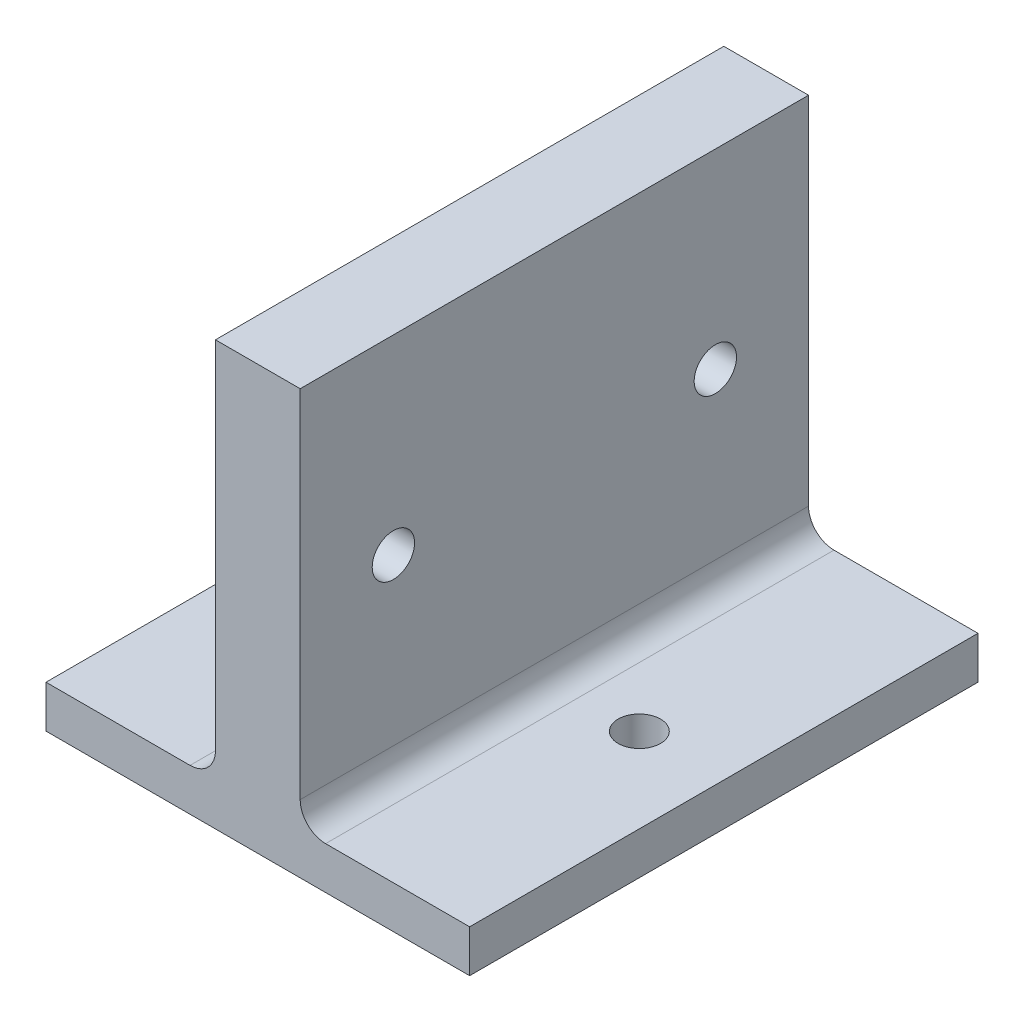
ISO-10303-21;
HEADER;
FILE_DESCRIPTION(('STEP AP214'),'2;1');
FILE_NAME('part.step','',(''),(''),'','','');
FILE_SCHEMA(('AUTOMOTIVE_DESIGN { 1 0 10303 214 1 1 1 1 }'));
ENDSEC;
DATA;
#1=APPLICATION_CONTEXT('core data for automotive mechanical design processes');
#2=APPLICATION_PROTOCOL_DEFINITION('international standard','automotive_design',2000,#1);
#3=PRODUCT_CONTEXT('',#1,'mechanical');
#4=PRODUCT('Part','Part','',(#3));
#5=PRODUCT_RELATED_PRODUCT_CATEGORY('part','',(#4));
#6=PRODUCT_DEFINITION_FORMATION('','',#4);
#7=PRODUCT_DEFINITION_CONTEXT('part definition',#1,'design');
#8=PRODUCT_DEFINITION('design','',#6,#7);
#9=PRODUCT_DEFINITION_SHAPE('','',#8);
#10=(LENGTH_UNIT() NAMED_UNIT(*) SI_UNIT(.MILLI.,.METRE.));
#11=(NAMED_UNIT(*) PLANE_ANGLE_UNIT() SI_UNIT($,.RADIAN.));
#12=(NAMED_UNIT(*) SI_UNIT($,.STERADIAN.) SOLID_ANGLE_UNIT());
#13=UNCERTAINTY_MEASURE_WITH_UNIT(LENGTH_MEASURE(1.E-05),#10,'distance_accuracy_value','');
#14=(GEOMETRIC_REPRESENTATION_CONTEXT(3) GLOBAL_UNCERTAINTY_ASSIGNED_CONTEXT((#13)) GLOBAL_UNIT_ASSIGNED_CONTEXT((#10,
#11,#12)) REPRESENTATION_CONTEXT('',''));
#15=CARTESIAN_POINT('',(0.,0.,0.));
#16=DIRECTION('',(0.,0.,1.));
#17=DIRECTION('',(1.,0.,0.));
#18=AXIS2_PLACEMENT_3D('',#15,#16,#17);
#19=CARTESIAN_POINT('',(0.,5.,0.));
#20=DIRECTION('',(0.,1.,0.));
#21=DIRECTION('',(0.,0.,1.));
#22=AXIS2_PLACEMENT_3D('',#19,#20,#21);
#23=PLANE('',#22);
#24=CARTESIAN_POINT('',(15.0283286948498,5.,0.));
#25=DIRECTION('',(0.,1.,0.));
#26=DIRECTION('',(0.,0.,1.));
#27=AXIS2_PLACEMENT_3D('',#24,#25,#26);
#28=CIRCLE('',#27,2.5);
#29=CARTESIAN_POINT('',(15.0283286948498,5.,2.5));
#30=VERTEX_POINT('',#29);
#31=EDGE_CURVE('E224',#30,#30,#28,.T.);
#32=ORIENTED_EDGE('',*,*,#31,.F.);
#33=EDGE_LOOP('',(#32));
#34=FACE_BOUND('',#33,.T.);
#35=DIRECTION('',(-1.,0.,0.));
#36=VECTOR('',#35,1.);
#37=CARTESIAN_POINT('',(-25.,5.,-30.));
#38=LINE('',#37,#36);
#39=CARTESIAN_POINT('',(25.,5.,-30.));
#40=VERTEX_POINT('',#39);
#41=CARTESIAN_POINT('',(8.,5.,-30.));
#42=VERTEX_POINT('',#41);
#43=EDGE_CURVE('E153',#40,#42,#38,.T.);
#44=ORIENTED_EDGE('',*,*,#43,.T.);
#45=DIRECTION('',(0.,0.,-1.));
#46=VECTOR('',#45,1.);
#47=CARTESIAN_POINT('',(8.,5.,0.));
#48=LINE('',#47,#46);
#49=CARTESIAN_POINT('',(8.,5.,30.));
#50=VERTEX_POINT('',#49);
#51=EDGE_CURVE('E178',#42,#50,#48,.F.);
#52=ORIENTED_EDGE('',*,*,#51,.T.);
#53=DIRECTION('',(1.,0.,0.));
#54=VECTOR('',#53,1.);
#55=CARTESIAN_POINT('',(-25.,5.,30.));
#56=LINE('',#55,#54);
#57=CARTESIAN_POINT('',(25.,5.,30.));
#58=VERTEX_POINT('',#57);
#59=EDGE_CURVE('E158',#50,#58,#56,.T.);
#60=ORIENTED_EDGE('',*,*,#59,.T.);
#61=DIRECTION('',(0.,0.,-1.));
#62=VECTOR('',#61,1.);
#63=CARTESIAN_POINT('',(25.,5.,-30.));
#64=LINE('',#63,#62);
#65=EDGE_CURVE('E148',#58,#40,#64,.T.);
#66=ORIENTED_EDGE('',*,*,#65,.T.);
#67=EDGE_LOOP('',(#44,#52,#60,#66));
#68=FACE_BOUND('',#67,.T.);
#69=ADVANCED_FACE('F38',(#34,#68),#23,.T.);
#70=CARTESIAN_POINT('',(25.,5.,-30.));
#71=DIRECTION('',(-1.,0.,0.));
#72=DIRECTION('',(0.,0.,1.));
#73=AXIS2_PLACEMENT_3D('',#70,#71,#72);
#74=PLANE('',#73);
#75=DIRECTION('',(0.,0.,-1.));
#76=VECTOR('',#75,1.);
#77=CARTESIAN_POINT('',(25.,0.,-30.));
#78=LINE('',#77,#76);
#79=CARTESIAN_POINT('',(25.,0.,30.));
#80=VERTEX_POINT('',#79);
#81=CARTESIAN_POINT('',(25.,0.,-30.));
#82=VERTEX_POINT('',#81);
#83=EDGE_CURVE('E139',#80,#82,#78,.T.);
#84=ORIENTED_EDGE('',*,*,#83,.T.);
#85=DIRECTION('',(0.,-1.,0.));
#86=VECTOR('',#85,1.);
#87=CARTESIAN_POINT('',(25.,5.,-30.));
#88=LINE('',#87,#86);
#89=EDGE_CURVE('E174',#40,#82,#88,.T.);
#90=ORIENTED_EDGE('',*,*,#89,.F.);
#91=ORIENTED_EDGE('',*,*,#65,.F.);
#92=DIRECTION('',(0.,-1.,0.));
#93=VECTOR('',#92,1.);
#94=CARTESIAN_POINT('',(25.,5.,30.));
#95=LINE('',#94,#93);
#96=EDGE_CURVE('E160',#58,#80,#95,.T.);
#97=ORIENTED_EDGE('',*,*,#96,.T.);
#98=EDGE_LOOP('',(#84,#90,#91,#97));
#99=FACE_BOUND('',#98,.T.);
#100=ADVANCED_FACE('F200',(#99),#74,.F.);
#101=CARTESIAN_POINT('',(-25.,5.,-30.));
#102=DIRECTION('',(0.,0.,1.));
#103=DIRECTION('',(1.,0.,0.));
#104=AXIS2_PLACEMENT_3D('',#101,#102,#103);
#105=PLANE('',#104);
#106=DIRECTION('',(-1.,0.,0.));
#107=VECTOR('',#106,1.);
#108=CARTESIAN_POINT('',(-25.,0.,-30.));
#109=LINE('',#108,#107);
#110=CARTESIAN_POINT('',(-25.,0.,-30.));
#111=VERTEX_POINT('',#110);
#112=EDGE_CURVE('E142',#82,#111,#109,.T.);
#113=ORIENTED_EDGE('',*,*,#112,.T.);
#114=DIRECTION('',(0.,-1.,0.));
#115=VECTOR('',#114,1.);
#116=CARTESIAN_POINT('',(-25.,5.,-30.));
#117=LINE('',#116,#115);
#118=CARTESIAN_POINT('',(-25.,5.,-30.));
#119=VERTEX_POINT('',#118);
#120=EDGE_CURVE('E171',#119,#111,#117,.T.);
#121=ORIENTED_EDGE('',*,*,#120,.F.);
#122=CARTESIAN_POINT('',(-8.,5.,-30.));
#123=VERTEX_POINT('',#122);
#124=EDGE_CURVE('E151',#123,#119,#38,.T.);
#125=ORIENTED_EDGE('',*,*,#124,.F.);
#126=CARTESIAN_POINT('',(-8.,8.,-30.));
#127=DIRECTION('',(0.,0.,1.));
#128=DIRECTION('',(1.,0.,0.));
#129=AXIS2_PLACEMENT_3D('',#126,#127,#128);
#130=CIRCLE('',#129,3.);
#131=CARTESIAN_POINT('',(-5.,8.00000000000001,-30.));
#132=VERTEX_POINT('',#131);
#133=EDGE_CURVE('E11',#123,#132,#130,.T.);
#134=ORIENTED_EDGE('',*,*,#133,.T.);
#135=DIRECTION('',(0.,-1.,0.));
#136=VECTOR('',#135,1.);
#137=CARTESIAN_POINT('',(-5.,50.,-30.));
#138=LINE('',#137,#136);
#139=CARTESIAN_POINT('',(-5.,50.,-30.));
#140=VERTEX_POINT('',#139);
#141=EDGE_CURVE('E120',#140,#132,#138,.T.);
#142=ORIENTED_EDGE('',*,*,#141,.F.);
#143=DIRECTION('',(-1.,0.,0.));
#144=VECTOR('',#143,1.);
#145=CARTESIAN_POINT('',(-5.,50.,-30.));
#146=LINE('',#145,#144);
#147=CARTESIAN_POINT('',(5.,50.,-30.));
#148=VERTEX_POINT('',#147);
#149=EDGE_CURVE('E114',#148,#140,#146,.T.);
#150=ORIENTED_EDGE('',*,*,#149,.F.);
#151=DIRECTION('',(0.,-1.,0.));
#152=VECTOR('',#151,1.);
#153=CARTESIAN_POINT('',(5.,50.,-30.));
#154=LINE('',#153,#152);
#155=CARTESIAN_POINT('',(5.,8.00000000000001,-30.));
#156=VERTEX_POINT('',#155);
#157=EDGE_CURVE('E118',#148,#156,#154,.T.);
#158=ORIENTED_EDGE('',*,*,#157,.T.);
#159=CARTESIAN_POINT('',(8.,8.,-30.));
#160=DIRECTION('',(0.,0.,1.));
#161=DIRECTION('',(1.,0.,0.));
#162=AXIS2_PLACEMENT_3D('',#159,#160,#161);
#163=CIRCLE('',#162,3.);
#164=EDGE_CURVE('E184',#156,#42,#163,.T.);
#165=ORIENTED_EDGE('',*,*,#164,.T.);
#166=ORIENTED_EDGE('',*,*,#43,.F.);
#167=ORIENTED_EDGE('',*,*,#89,.T.);
#168=EDGE_LOOP('',(#113,#121,#125,#134,#142,#150,#158,#165,#166,#167));
#169=FACE_BOUND('',#168,.T.);
#170=ADVANCED_FACE('F116',(#169),#105,.F.);
#171=CARTESIAN_POINT('',(-25.,5.,-30.));
#172=DIRECTION('',(1.,0.,0.));
#173=DIRECTION('',(0.,0.,-1.));
#174=AXIS2_PLACEMENT_3D('',#171,#172,#173);
#175=PLANE('',#174);
#176=DIRECTION('',(0.,0.,1.));
#177=VECTOR('',#176,1.);
#178=CARTESIAN_POINT('',(-25.,0.,-30.));
#179=LINE('',#178,#177);
#180=CARTESIAN_POINT('',(-25.,0.,30.));
#181=VERTEX_POINT('',#180);
#182=EDGE_CURVE('E163',#111,#181,#179,.T.);
#183=ORIENTED_EDGE('',*,*,#182,.T.);
#184=DIRECTION('',(0.,-1.,0.));
#185=VECTOR('',#184,1.);
#186=CARTESIAN_POINT('',(-25.,5.,30.));
#187=LINE('',#186,#185);
#188=CARTESIAN_POINT('',(-25.,5.,30.));
#189=VERTEX_POINT('',#188);
#190=EDGE_CURVE('E168',#189,#181,#187,.T.);
#191=ORIENTED_EDGE('',*,*,#190,.F.);
#192=DIRECTION('',(0.,0.,1.));
#193=VECTOR('',#192,1.);
#194=CARTESIAN_POINT('',(-25.,5.,-30.));
#195=LINE('',#194,#193);
#196=EDGE_CURVE('E156',#119,#189,#195,.T.);
#197=ORIENTED_EDGE('',*,*,#196,.F.);
#198=ORIENTED_EDGE('',*,*,#120,.T.);
#199=EDGE_LOOP('',(#183,#191,#197,#198));
#200=FACE_BOUND('',#199,.T.);
#201=ADVANCED_FACE('F207',(#200),#175,.F.);
#202=CARTESIAN_POINT('',(-25.,5.,30.));
#203=DIRECTION('',(0.,0.,-1.));
#204=DIRECTION('',(-1.,0.,0.));
#205=AXIS2_PLACEMENT_3D('',#202,#203,#204);
#206=PLANE('',#205);
#207=DIRECTION('',(1.,0.,0.));
#208=VECTOR('',#207,1.);
#209=CARTESIAN_POINT('',(-25.,0.,30.));
#210=LINE('',#209,#208);
#211=EDGE_CURVE('E152',#181,#80,#210,.T.);
#212=ORIENTED_EDGE('',*,*,#211,.T.);
#213=ORIENTED_EDGE('',*,*,#96,.F.);
#214=ORIENTED_EDGE('',*,*,#59,.F.);
#215=CARTESIAN_POINT('',(8.,8.,30.));
#216=DIRECTION('',(0.,0.,-1.));
#217=DIRECTION('',(-1.,0.,0.));
#218=AXIS2_PLACEMENT_3D('',#215,#216,#217);
#219=CIRCLE('',#218,3.);
#220=CARTESIAN_POINT('',(5.,8.00000000000001,30.));
#221=VERTEX_POINT('',#220);
#222=EDGE_CURVE('E186',#50,#221,#219,.T.);
#223=ORIENTED_EDGE('',*,*,#222,.T.);
#224=DIRECTION('',(0.,-1.,0.));
#225=VECTOR('',#224,1.);
#226=CARTESIAN_POINT('',(5.,50.,30.));
#227=LINE('',#226,#225);
#228=CARTESIAN_POINT('',(5.,50.,30.));
#229=VERTEX_POINT('',#228);
#230=EDGE_CURVE('E190',#229,#221,#227,.T.);
#231=ORIENTED_EDGE('',*,*,#230,.F.);
#232=DIRECTION('',(1.,0.,0.));
#233=VECTOR('',#232,1.);
#234=CARTESIAN_POINT('',(-5.,50.,30.));
#235=LINE('',#234,#233);
#236=CARTESIAN_POINT('',(-5.,50.,30.));
#237=VERTEX_POINT('',#236);
#238=EDGE_CURVE('E129',#237,#229,#235,.T.);
#239=ORIENTED_EDGE('',*,*,#238,.F.);
#240=DIRECTION('',(0.,-1.,0.));
#241=VECTOR('',#240,1.);
#242=CARTESIAN_POINT('',(-5.,50.,30.));
#243=LINE('',#242,#241);
#244=CARTESIAN_POINT('',(-5.,8.00000000000001,30.));
#245=VERTEX_POINT('',#244);
#246=EDGE_CURVE('E144',#237,#245,#243,.T.);
#247=ORIENTED_EDGE('',*,*,#246,.T.);
#248=CARTESIAN_POINT('',(-8.,8.,30.));
#249=DIRECTION('',(0.,0.,-1.));
#250=DIRECTION('',(-1.,0.,0.));
#251=AXIS2_PLACEMENT_3D('',#248,#249,#250);
#252=CIRCLE('',#251,3.);
#253=CARTESIAN_POINT('',(-8.,5.,30.));
#254=VERTEX_POINT('',#253);
#255=EDGE_CURVE('E46',#245,#254,#252,.T.);
#256=ORIENTED_EDGE('',*,*,#255,.T.);
#257=EDGE_CURVE('E159',#189,#254,#56,.T.);
#258=ORIENTED_EDGE('',*,*,#257,.F.);
#259=ORIENTED_EDGE('',*,*,#190,.T.);
#260=EDGE_LOOP('',(#212,#213,#214,#223,#231,#239,#247,#256,#258,#259));
#261=FACE_BOUND('',#260,.T.);
#262=ADVANCED_FACE('F189',(#261),#206,.F.);
#263=CARTESIAN_POINT('',(-15.0283286948498,5.,0.));
#264=DIRECTION('',(0.,1.,0.));
#265=DIRECTION('',(0.,0.,1.));
#266=AXIS2_PLACEMENT_3D('',#263,#264,#265);
#267=CIRCLE('',#266,2.5);
#268=CARTESIAN_POINT('',(-15.0283286948498,5.,2.50000000000001));
#269=VERTEX_POINT('',#268);
#270=EDGE_CURVE('E228',#269,#269,#267,.T.);
#271=ORIENTED_EDGE('',*,*,#270,.F.);
#272=EDGE_LOOP('',(#271));
#273=FACE_BOUND('',#272,.T.);
#274=ORIENTED_EDGE('',*,*,#257,.T.);
#275=DIRECTION('',(0.,0.,1.));
#276=VECTOR('',#275,1.);
#277=CARTESIAN_POINT('',(-8.,5.,0.));
#278=LINE('',#277,#276);
#279=EDGE_CURVE('E59',#254,#123,#278,.F.);
#280=ORIENTED_EDGE('',*,*,#279,.T.);
#281=ORIENTED_EDGE('',*,*,#124,.T.);
#282=ORIENTED_EDGE('',*,*,#196,.T.);
#283=EDGE_LOOP('',(#274,#280,#281,#282));
#284=FACE_BOUND('',#283,.T.);
#285=ADVANCED_FACE('F211',(#273,#284),#23,.T.);
#286=CARTESIAN_POINT('',(0.,0.,0.));
#287=DIRECTION('',(0.,1.,0.));
#288=DIRECTION('',(0.,0.,1.));
#289=AXIS2_PLACEMENT_3D('',#286,#287,#288);
#290=PLANE('',#289);
#291=CARTESIAN_POINT('',(-15.0283286948498,0.,0.));
#292=DIRECTION('',(0.,1.,0.));
#293=DIRECTION('',(0.,0.,1.));
#294=AXIS2_PLACEMENT_3D('',#291,#292,#293);
#295=CIRCLE('',#294,2.5);
#296=CARTESIAN_POINT('',(-15.0283286948498,0.,2.50000000000001));
#297=VERTEX_POINT('',#296);
#298=EDGE_CURVE('E133',#297,#297,#295,.T.);
#299=ORIENTED_EDGE('',*,*,#298,.T.);
#300=EDGE_LOOP('',(#299));
#301=FACE_BOUND('',#300,.T.);
#302=CARTESIAN_POINT('',(15.0283286948498,0.,0.));
#303=DIRECTION('',(0.,1.,0.));
#304=DIRECTION('',(0.,0.,1.));
#305=AXIS2_PLACEMENT_3D('',#302,#303,#304);
#306=CIRCLE('',#305,2.5);
#307=CARTESIAN_POINT('',(15.0283286948498,0.,2.5));
#308=VERTEX_POINT('',#307);
#309=EDGE_CURVE('E221',#308,#308,#306,.T.);
#310=ORIENTED_EDGE('',*,*,#309,.T.);
#311=EDGE_LOOP('',(#310));
#312=FACE_BOUND('',#311,.T.);
#313=ORIENTED_EDGE('',*,*,#83,.F.);
#314=ORIENTED_EDGE('',*,*,#211,.F.);
#315=ORIENTED_EDGE('',*,*,#182,.F.);
#316=ORIENTED_EDGE('',*,*,#112,.F.);
#317=EDGE_LOOP('',(#313,#314,#315,#316));
#318=FACE_BOUND('',#317,.T.);
#319=ADVANCED_FACE('F210',(#301,#312,#318),#290,.F.);
#320=CARTESIAN_POINT('',(5.,50.,-30.));
#321=DIRECTION('',(-1.,0.,0.));
#322=DIRECTION('',(0.,0.,1.));
#323=AXIS2_PLACEMENT_3D('',#320,#321,#322);
#324=PLANE('',#323);
#325=CARTESIAN_POINT('',(5.,27.5,19.));
#326=DIRECTION('',(-1.,0.,0.));
#327=DIRECTION('',(0.,0.,1.));
#328=AXIS2_PLACEMENT_3D('',#325,#326,#327);
#329=CIRCLE('',#328,2.5);
#330=CARTESIAN_POINT('',(5.,27.5,21.5));
#331=VERTEX_POINT('',#330);
#332=EDGE_CURVE('E225',#331,#331,#329,.F.);
#333=ORIENTED_EDGE('',*,*,#332,.F.);
#334=EDGE_LOOP('',(#333));
#335=FACE_BOUND('',#334,.T.);
#336=CARTESIAN_POINT('',(5.,27.5,-19.));
#337=DIRECTION('',(-1.,0.,0.));
#338=DIRECTION('',(0.,0.,1.));
#339=AXIS2_PLACEMENT_3D('',#336,#337,#338);
#340=CIRCLE('',#339,2.5);
#341=CARTESIAN_POINT('',(5.,27.5,-16.5));
#342=VERTEX_POINT('',#341);
#343=EDGE_CURVE('E237',#342,#342,#340,.F.);
#344=ORIENTED_EDGE('',*,*,#343,.F.);
#345=EDGE_LOOP('',(#344));
#346=FACE_BOUND('',#345,.T.);
#347=ORIENTED_EDGE('',*,*,#230,.T.);
#348=DIRECTION('',(0.,0.,-1.));
#349=VECTOR('',#348,1.);
#350=CARTESIAN_POINT('',(5.,8.,-30.));
#351=LINE('',#350,#349);
#352=EDGE_CURVE('E138',#221,#156,#351,.T.);
#353=ORIENTED_EDGE('',*,*,#352,.T.);
#354=ORIENTED_EDGE('',*,*,#157,.F.);
#355=DIRECTION('',(0.,0.,-1.));
#356=VECTOR('',#355,1.);
#357=CARTESIAN_POINT('',(5.,50.,-30.));
#358=LINE('',#357,#356);
#359=EDGE_CURVE('E124',#229,#148,#358,.T.);
#360=ORIENTED_EDGE('',*,*,#359,.F.);
#361=EDGE_LOOP('',(#347,#353,#354,#360));
#362=FACE_BOUND('',#361,.T.);
#363=ADVANCED_FACE('F136',(#335,#346,#362),#324,.F.);
#364=CARTESIAN_POINT('',(-5.,50.,-30.));
#365=DIRECTION('',(1.,0.,0.));
#366=DIRECTION('',(0.,0.,-1.));
#367=AXIS2_PLACEMENT_3D('',#364,#365,#366);
#368=PLANE('',#367);
#369=CARTESIAN_POINT('',(-5.,27.5,19.));
#370=DIRECTION('',(-1.,0.,0.));
#371=DIRECTION('',(0.,0.,1.));
#372=AXIS2_PLACEMENT_3D('',#369,#370,#371);
#373=CIRCLE('',#372,2.5);
#374=CARTESIAN_POINT('',(-5.,27.5,21.5));
#375=VERTEX_POINT('',#374);
#376=EDGE_CURVE('E236',#375,#375,#373,.T.);
#377=ORIENTED_EDGE('',*,*,#376,.F.);
#378=EDGE_LOOP('',(#377));
#379=FACE_BOUND('',#378,.T.);
#380=CARTESIAN_POINT('',(-5.,27.5,-19.));
#381=DIRECTION('',(-1.,0.,0.));
#382=DIRECTION('',(0.,0.,1.));
#383=AXIS2_PLACEMENT_3D('',#380,#381,#382);
#384=CIRCLE('',#383,2.5);
#385=CARTESIAN_POINT('',(-5.,27.5,-16.5));
#386=VERTEX_POINT('',#385);
#387=EDGE_CURVE('E233',#386,#386,#384,.T.);
#388=ORIENTED_EDGE('',*,*,#387,.F.);
#389=EDGE_LOOP('',(#388));
#390=FACE_BOUND('',#389,.T.);
#391=ORIENTED_EDGE('',*,*,#141,.T.);
#392=DIRECTION('',(0.,0.,1.));
#393=VECTOR('',#392,1.);
#394=CARTESIAN_POINT('',(-5.,8.,-30.));
#395=LINE('',#394,#393);
#396=EDGE_CURVE('E180',#132,#245,#395,.T.);
#397=ORIENTED_EDGE('',*,*,#396,.T.);
#398=ORIENTED_EDGE('',*,*,#246,.F.);
#399=DIRECTION('',(0.,0.,1.));
#400=VECTOR('',#399,1.);
#401=CARTESIAN_POINT('',(-5.,50.,-30.));
#402=LINE('',#401,#400);
#403=EDGE_CURVE('E123',#140,#237,#402,.T.);
#404=ORIENTED_EDGE('',*,*,#403,.F.);
#405=EDGE_LOOP('',(#391,#397,#398,#404));
#406=FACE_BOUND('',#405,.T.);
#407=ADVANCED_FACE('F216',(#379,#390,#406),#368,.F.);
#408=CARTESIAN_POINT('',(0.,50.,0.));
#409=DIRECTION('',(0.,1.,0.));
#410=DIRECTION('',(0.,0.,1.));
#411=AXIS2_PLACEMENT_3D('',#408,#409,#410);
#412=PLANE('',#411);
#413=ORIENTED_EDGE('',*,*,#359,.T.);
#414=ORIENTED_EDGE('',*,*,#149,.T.);
#415=ORIENTED_EDGE('',*,*,#403,.T.);
#416=ORIENTED_EDGE('',*,*,#238,.T.);
#417=EDGE_LOOP('',(#413,#414,#415,#416));
#418=FACE_BOUND('',#417,.T.);
#419=ADVANCED_FACE('F127',(#418),#412,.T.);
#420=CARTESIAN_POINT('',(15.0283286948498,0.,0.));
#421=DIRECTION('',(0.,1.,0.));
#422=DIRECTION('',(0.,0.,1.));
#423=AXIS2_PLACEMENT_3D('',#420,#421,#422);
#424=CYLINDRICAL_SURFACE('',#423,2.5);
#425=ORIENTED_EDGE('',*,*,#309,.F.);
#426=EDGE_LOOP('',(#425));
#427=FACE_BOUND('',#426,.T.);
#428=ORIENTED_EDGE('',*,*,#31,.T.);
#429=EDGE_LOOP('',(#428));
#430=FACE_BOUND('',#429,.T.);
#431=ADVANCED_FACE('F286',(#427,#430),#424,.F.);
#432=CARTESIAN_POINT('',(-15.0283286948498,0.,0.));
#433=DIRECTION('',(0.,1.,0.));
#434=DIRECTION('',(0.,0.,1.));
#435=AXIS2_PLACEMENT_3D('',#432,#433,#434);
#436=CYLINDRICAL_SURFACE('',#435,2.5);
#437=ORIENTED_EDGE('',*,*,#298,.F.);
#438=EDGE_LOOP('',(#437));
#439=FACE_BOUND('',#438,.T.);
#440=ORIENTED_EDGE('',*,*,#270,.T.);
#441=EDGE_LOOP('',(#440));
#442=FACE_BOUND('',#441,.T.);
#443=ADVANCED_FACE('F256',(#439,#442),#436,.F.);
#444=CARTESIAN_POINT('',(25.001,27.5,-19.));
#445=DIRECTION('',(-1.,0.,0.));
#446=DIRECTION('',(0.,0.,1.));
#447=AXIS2_PLACEMENT_3D('',#444,#445,#446);
#448=CYLINDRICAL_SURFACE('',#447,2.5);
#449=ORIENTED_EDGE('',*,*,#387,.T.);
#450=EDGE_LOOP('',(#449));
#451=FACE_BOUND('',#450,.T.);
#452=ORIENTED_EDGE('',*,*,#343,.T.);
#453=EDGE_LOOP('',(#452));
#454=FACE_BOUND('',#453,.T.);
#455=ADVANCED_FACE('F253',(#451,#454),#448,.F.);
#456=CARTESIAN_POINT('',(25.001,27.5,19.));
#457=DIRECTION('',(-1.,0.,0.));
#458=DIRECTION('',(0.,0.,1.));
#459=AXIS2_PLACEMENT_3D('',#456,#457,#458);
#460=CYLINDRICAL_SURFACE('',#459,2.5);
#461=ORIENTED_EDGE('',*,*,#376,.T.);
#462=EDGE_LOOP('',(#461));
#463=FACE_BOUND('',#462,.T.);
#464=ORIENTED_EDGE('',*,*,#332,.T.);
#465=EDGE_LOOP('',(#464));
#466=FACE_BOUND('',#465,.T.);
#467=ADVANCED_FACE('F245',(#463,#466),#460,.F.);
#468=CARTESIAN_POINT('',(8.,8.,-30.));
#469=DIRECTION('',(0.,0.,-1.));
#470=DIRECTION('',(-1.,0.,0.));
#471=AXIS2_PLACEMENT_3D('',#468,#469,#470);
#472=CYLINDRICAL_SURFACE('',#471,3.);
#473=ORIENTED_EDGE('',*,*,#222,.F.);
#474=ORIENTED_EDGE('',*,*,#51,.F.);
#475=ORIENTED_EDGE('',*,*,#164,.F.);
#476=ORIENTED_EDGE('',*,*,#352,.F.);
#477=EDGE_LOOP('',(#473,#474,#475,#476));
#478=FACE_BOUND('',#477,.T.);
#479=ADVANCED_FACE('F195',(#478),#472,.F.);
#480=CARTESIAN_POINT('',(-8.,8.,-30.));
#481=DIRECTION('',(0.,0.,1.));
#482=DIRECTION('',(1.,0.,0.));
#483=AXIS2_PLACEMENT_3D('',#480,#481,#482);
#484=CYLINDRICAL_SURFACE('',#483,3.);
#485=ORIENTED_EDGE('',*,*,#133,.F.);
#486=ORIENTED_EDGE('',*,*,#279,.F.);
#487=ORIENTED_EDGE('',*,*,#255,.F.);
#488=ORIENTED_EDGE('',*,*,#396,.F.);
#489=EDGE_LOOP('',(#485,#486,#487,#488));
#490=FACE_BOUND('',#489,.T.);
#491=ADVANCED_FACE('F40',(#490),#484,.F.);
#492=CLOSED_SHELL('',(#69,#100,#170,#201,#262,#285,#319,#363,#407,#419,#431,#443,#455,#467,#479,#491));
#493=MANIFOLD_SOLID_BREP('B2',#492);
#494=ADVANCED_BREP_SHAPE_REPRESENTATION('',(#18,#493),#14);
#495=SHAPE_DEFINITION_REPRESENTATION(#9,#494);
ENDSEC;
END-ISO-10303-21;
